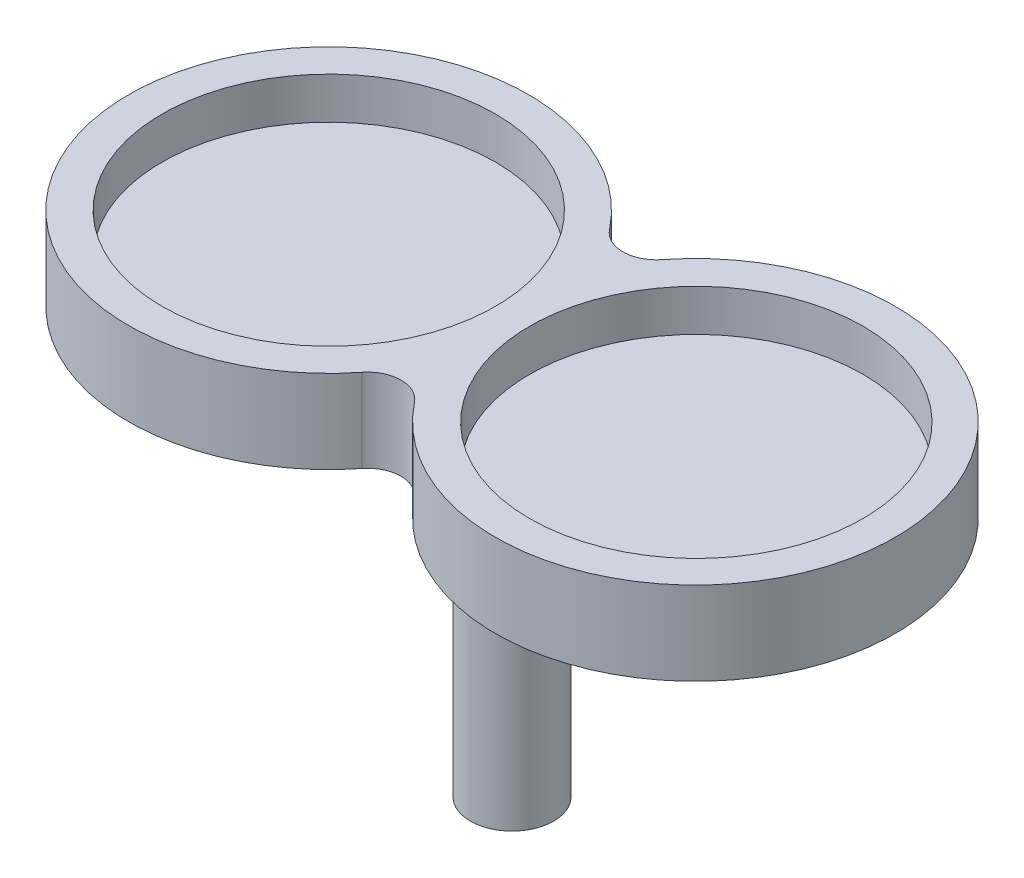
ISO-10303-21;
HEADER;
FILE_DESCRIPTION(('STEP AP214'),'2;1');
FILE_NAME('part.step','',(''),(''),'','','');
FILE_SCHEMA(('AUTOMOTIVE_DESIGN { 1 0 10303 214 1 1 1 1 }'));
ENDSEC;
DATA;
#1=APPLICATION_CONTEXT('core data for automotive mechanical design processes');
#2=APPLICATION_PROTOCOL_DEFINITION('international standard','automotive_design',2000,#1);
#3=PRODUCT_CONTEXT('',#1,'mechanical');
#4=PRODUCT('Part','Part','',(#3));
#5=PRODUCT_RELATED_PRODUCT_CATEGORY('part','',(#4));
#6=PRODUCT_DEFINITION_FORMATION('','',#4);
#7=PRODUCT_DEFINITION_CONTEXT('part definition',#1,'design');
#8=PRODUCT_DEFINITION('design','',#6,#7);
#9=PRODUCT_DEFINITION_SHAPE('','',#8);
#10=(LENGTH_UNIT() NAMED_UNIT(*) SI_UNIT(.MILLI.,.METRE.));
#11=(NAMED_UNIT(*) PLANE_ANGLE_UNIT() SI_UNIT($,.RADIAN.));
#12=(NAMED_UNIT(*) SI_UNIT($,.STERADIAN.) SOLID_ANGLE_UNIT());
#13=UNCERTAINTY_MEASURE_WITH_UNIT(LENGTH_MEASURE(1.E-05),#10,'distance_accuracy_value','');
#14=(GEOMETRIC_REPRESENTATION_CONTEXT(3) GLOBAL_UNCERTAINTY_ASSIGNED_CONTEXT((#13)) GLOBAL_UNIT_ASSIGNED_CONTEXT((#10,
#11,#12)) REPRESENTATION_CONTEXT('',''));
#15=CARTESIAN_POINT('',(0.,0.,0.));
#16=DIRECTION('',(0.,0.,1.));
#17=DIRECTION('',(1.,0.,0.));
#18=AXIS2_PLACEMENT_3D('',#15,#16,#17);
#19=CARTESIAN_POINT('',(-13.97,6.35,0.));
#20=DIRECTION('',(0.,-1.,0.));
#21=DIRECTION('',(0.,0.,-1.));
#22=AXIS2_PLACEMENT_3D('',#19,#20,#21);
#23=CYLINDRICAL_SURFACE('',#22,15.24);
#24=CARTESIAN_POINT('',(-13.97,0.,0.));
#25=DIRECTION('',(0.,1.,0.));
#26=DIRECTION('',(0.,0.,1.));
#27=AXIS2_PLACEMENT_3D('',#24,#25,#26);
#28=CIRCLE('',#27,15.24);
#29=CARTESIAN_POINT('',(-1.99571428571429,0.,-9.42730510976774));
#30=VERTEX_POINT('',#29);
#31=CARTESIAN_POINT('',(-1.99571428571428,0.,9.42730510976774));
#32=VERTEX_POINT('',#31);
#33=EDGE_CURVE('E106',#30,#32,#28,.T.);
#34=ORIENTED_EDGE('',*,*,#33,.T.);
#35=DIRECTION('',(0.,-1.,0.));
#36=VECTOR('',#35,1.);
#37=CARTESIAN_POINT('',(-1.99571428571428,6.35,9.42730510976775));
#38=LINE('',#37,#36);
#39=CARTESIAN_POINT('',(-1.99571428571428,6.35,9.42730510976774));
#40=VERTEX_POINT('',#39);
#41=EDGE_CURVE('E55',#32,#40,#38,.F.);
#42=ORIENTED_EDGE('',*,*,#41,.T.);
#43=CARTESIAN_POINT('',(-13.97,6.35,0.));
#44=DIRECTION('',(0.,1.,0.));
#45=DIRECTION('',(0.,0.,1.));
#46=AXIS2_PLACEMENT_3D('',#43,#44,#45);
#47=CIRCLE('',#46,15.24);
#48=CARTESIAN_POINT('',(-1.99571428571429,6.35,-9.42730510976774));
#49=VERTEX_POINT('',#48);
#50=EDGE_CURVE('E105',#49,#40,#47,.T.);
#51=ORIENTED_EDGE('',*,*,#50,.F.);
#52=DIRECTION('',(0.,-1.,0.));
#53=VECTOR('',#52,1.);
#54=CARTESIAN_POINT('',(-1.99571428571428,6.35,-9.42730510976774));
#55=LINE('',#54,#53);
#56=EDGE_CURVE('E100',#49,#30,#55,.T.);
#57=ORIENTED_EDGE('',*,*,#56,.T.);
#58=EDGE_LOOP('',(#34,#42,#51,#57));
#59=FACE_BOUND('',#58,.T.);
#60=ADVANCED_FACE('F39',(#59),#23,.T.);
#61=CARTESIAN_POINT('',(13.97,6.35,0.));
#62=DIRECTION('',(0.,-1.,0.));
#63=DIRECTION('',(0.,0.,-1.));
#64=AXIS2_PLACEMENT_3D('',#61,#62,#63);
#65=CYLINDRICAL_SURFACE('',#64,15.24);
#66=CARTESIAN_POINT('',(13.97,6.35,0.));
#67=DIRECTION('',(0.,1.,0.));
#68=DIRECTION('',(0.,0.,1.));
#69=AXIS2_PLACEMENT_3D('',#66,#67,#68);
#70=CIRCLE('',#69,15.24);
#71=CARTESIAN_POINT('',(1.99571428571429,6.35,9.42730510976774));
#72=VERTEX_POINT('',#71);
#73=CARTESIAN_POINT('',(1.99571428571428,6.35,-9.42730510976774));
#74=VERTEX_POINT('',#73);
#75=EDGE_CURVE('E98',#72,#74,#70,.T.);
#76=ORIENTED_EDGE('',*,*,#75,.F.);
#77=DIRECTION('',(0.,-1.,0.));
#78=VECTOR('',#77,1.);
#79=CARTESIAN_POINT('',(1.99571428571428,6.35,9.42730510976775));
#80=LINE('',#79,#78);
#81=CARTESIAN_POINT('',(1.99571428571429,0.,9.42730510976774));
#82=VERTEX_POINT('',#81);
#83=EDGE_CURVE('E84',#72,#82,#80,.T.);
#84=ORIENTED_EDGE('',*,*,#83,.T.);
#85=CARTESIAN_POINT('',(13.97,0.,0.));
#86=DIRECTION('',(0.,1.,0.));
#87=DIRECTION('',(0.,0.,1.));
#88=AXIS2_PLACEMENT_3D('',#85,#86,#87);
#89=CIRCLE('',#88,15.24);
#90=CARTESIAN_POINT('',(1.99571428571428,0.,-9.42730510976774));
#91=VERTEX_POINT('',#90);
#92=EDGE_CURVE('E96',#82,#91,#89,.T.);
#93=ORIENTED_EDGE('',*,*,#92,.T.);
#94=DIRECTION('',(0.,-1.,0.));
#95=VECTOR('',#94,1.);
#96=CARTESIAN_POINT('',(1.99571428571428,6.35,-9.42730510976774));
#97=LINE('',#96,#95);
#98=EDGE_CURVE('E101',#91,#74,#97,.F.);
#99=ORIENTED_EDGE('',*,*,#98,.T.);
#100=EDGE_LOOP('',(#76,#84,#93,#99));
#101=FACE_BOUND('',#100,.T.);
#102=ADVANCED_FACE('F95',(#101),#65,.T.);
#103=CARTESIAN_POINT('',(0.,6.35,0.));
#104=DIRECTION('',(0.,1.,0.));
#105=DIRECTION('',(0.,0.,1.));
#106=AXIS2_PLACEMENT_3D('',#103,#104,#105);
#107=PLANE('',#106);
#108=CARTESIAN_POINT('',(14.045562681836,6.35,0.));
#109=DIRECTION('',(0.,1.,0.));
#110=DIRECTION('',(0.,0.,1.));
#111=AXIS2_PLACEMENT_3D('',#108,#109,#110);
#112=CIRCLE('',#111,12.7);
#113=CARTESIAN_POINT('',(14.045562681836,6.35,12.7));
#114=VERTEX_POINT('',#113);
#115=EDGE_CURVE('E141',#114,#114,#112,.T.);
#116=ORIENTED_EDGE('',*,*,#115,.F.);
#117=EDGE_LOOP('',(#116));
#118=FACE_BOUND('',#117,.T.);
#119=CARTESIAN_POINT('',(-13.9596590883997,6.35,0.));
#120=DIRECTION('',(0.,1.,0.));
#121=DIRECTION('',(0.,0.,1.));
#122=AXIS2_PLACEMENT_3D('',#119,#120,#121);
#123=CIRCLE('',#122,12.7);
#124=CARTESIAN_POINT('',(-13.9596590883997,6.35,12.7));
#125=VERTEX_POINT('',#124);
#126=EDGE_CURVE('E133',#125,#125,#123,.T.);
#127=ORIENTED_EDGE('',*,*,#126,.F.);
#128=EDGE_LOOP('',(#127));
#129=FACE_BOUND('',#128,.T.);
#130=ORIENTED_EDGE('',*,*,#75,.T.);
#131=CARTESIAN_POINT('',(0.,6.35,-10.9985226280624));
#132=DIRECTION('',(0.,1.,0.));
#133=DIRECTION('',(0.,0.,1.));
#134=AXIS2_PLACEMENT_3D('',#131,#132,#133);
#135=CIRCLE('',#134,2.54);
#136=EDGE_CURVE('E11',#74,#49,#135,.F.);
#137=ORIENTED_EDGE('',*,*,#136,.T.);
#138=ORIENTED_EDGE('',*,*,#50,.T.);
#139=CARTESIAN_POINT('',(0.,6.35,10.9985226280624));
#140=DIRECTION('',(0.,1.,0.));
#141=DIRECTION('',(0.,0.,1.));
#142=AXIS2_PLACEMENT_3D('',#139,#140,#141);
#143=CIRCLE('',#142,2.54);
#144=EDGE_CURVE('E89',#40,#72,#143,.F.);
#145=ORIENTED_EDGE('',*,*,#144,.T.);
#146=EDGE_LOOP('',(#130,#137,#138,#145));
#147=FACE_BOUND('',#146,.T.);
#148=ADVANCED_FACE('F173',(#118,#129,#147),#107,.T.);
#149=CARTESIAN_POINT('',(0.,0.,0.));
#150=DIRECTION('',(0.,1.,0.));
#151=DIRECTION('',(0.,0.,1.));
#152=AXIS2_PLACEMENT_3D('',#149,#150,#151);
#153=PLANE('',#152);
#154=CARTESIAN_POINT('',(0.,0.,0.));
#155=DIRECTION('',(0.,1.,0.));
#156=DIRECTION('',(0.,0.,1.));
#157=AXIS2_PLACEMENT_3D('',#154,#155,#156);
#158=CIRCLE('',#157,5.715);
#159=CARTESIAN_POINT('',(0.,0.,5.715));
#160=VERTEX_POINT('',#159);
#161=EDGE_CURVE('E90',#160,#160,#158,.T.);
#162=ORIENTED_EDGE('',*,*,#161,.T.);
#163=EDGE_LOOP('',(#162));
#164=FACE_BOUND('',#163,.T.);
#165=ORIENTED_EDGE('',*,*,#33,.F.);
#166=CARTESIAN_POINT('',(0.,0.,-10.9985226280624));
#167=DIRECTION('',(0.,1.,0.));
#168=DIRECTION('',(0.,0.,1.));
#169=AXIS2_PLACEMENT_3D('',#166,#167,#168);
#170=CIRCLE('',#169,2.54);
#171=EDGE_CURVE('E48',#30,#91,#170,.T.);
#172=ORIENTED_EDGE('',*,*,#171,.T.);
#173=ORIENTED_EDGE('',*,*,#92,.F.);
#174=CARTESIAN_POINT('',(0.,0.,10.9985226280624));
#175=DIRECTION('',(0.,1.,0.));
#176=DIRECTION('',(0.,0.,1.));
#177=AXIS2_PLACEMENT_3D('',#174,#175,#176);
#178=CIRCLE('',#177,2.54);
#179=EDGE_CURVE('E80',#82,#32,#178,.T.);
#180=ORIENTED_EDGE('',*,*,#179,.T.);
#181=EDGE_LOOP('',(#165,#172,#173,#180));
#182=FACE_BOUND('',#181,.T.);
#183=ADVANCED_FACE('F103',(#164,#182),#153,.F.);
#184=CARTESIAN_POINT('',(-13.9596590883997,3.175,0.));
#185=DIRECTION('',(0.,1.,0.));
#186=DIRECTION('',(0.,0.,1.));
#187=AXIS2_PLACEMENT_3D('',#184,#185,#186);
#188=CYLINDRICAL_SURFACE('',#187,12.7);
#189=CARTESIAN_POINT('',(-13.9596590883997,3.175,0.));
#190=DIRECTION('',(0.,1.,0.));
#191=DIRECTION('',(0.,0.,1.));
#192=AXIS2_PLACEMENT_3D('',#189,#190,#191);
#193=CIRCLE('',#192,12.7);
#194=CARTESIAN_POINT('',(-13.9596590883997,3.175,12.7));
#195=VERTEX_POINT('',#194);
#196=EDGE_CURVE('E111',#195,#195,#193,.T.);
#197=ORIENTED_EDGE('',*,*,#196,.F.);
#198=EDGE_LOOP('',(#197));
#199=FACE_BOUND('',#198,.T.);
#200=ORIENTED_EDGE('',*,*,#126,.T.);
#201=EDGE_LOOP('',(#200));
#202=FACE_BOUND('',#201,.T.);
#203=ADVANCED_FACE('F192',(#199,#202),#188,.F.);
#204=CARTESIAN_POINT('',(-13.9596590883997,3.175,0.));
#205=DIRECTION('',(0.,1.,0.));
#206=DIRECTION('',(0.,0.,1.));
#207=AXIS2_PLACEMENT_3D('',#204,#205,#206);
#208=PLANE('',#207);
#209=ORIENTED_EDGE('',*,*,#196,.T.);
#210=EDGE_LOOP('',(#209));
#211=FACE_BOUND('',#210,.T.);
#212=ADVANCED_FACE('F199',(#211),#208,.T.);
#213=CARTESIAN_POINT('',(14.045562681836,3.175,0.));
#214=DIRECTION('',(0.,1.,0.));
#215=DIRECTION('',(0.,0.,1.));
#216=AXIS2_PLACEMENT_3D('',#213,#214,#215);
#217=CYLINDRICAL_SURFACE('',#216,12.7);
#218=CARTESIAN_POINT('',(14.045562681836,3.175,0.));
#219=DIRECTION('',(0.,1.,0.));
#220=DIRECTION('',(0.,0.,1.));
#221=AXIS2_PLACEMENT_3D('',#218,#219,#220);
#222=CIRCLE('',#221,12.7);
#223=CARTESIAN_POINT('',(14.045562681836,3.175,12.7));
#224=VERTEX_POINT('',#223);
#225=EDGE_CURVE('E137',#224,#224,#222,.T.);
#226=ORIENTED_EDGE('',*,*,#225,.F.);
#227=EDGE_LOOP('',(#226));
#228=FACE_BOUND('',#227,.T.);
#229=ORIENTED_EDGE('',*,*,#115,.T.);
#230=EDGE_LOOP('',(#229));
#231=FACE_BOUND('',#230,.T.);
#232=ADVANCED_FACE('F165',(#228,#231),#217,.F.);
#233=CARTESIAN_POINT('',(14.045562681836,3.175,0.));
#234=DIRECTION('',(0.,1.,0.));
#235=DIRECTION('',(0.,0.,1.));
#236=AXIS2_PLACEMENT_3D('',#233,#234,#235);
#237=PLANE('',#236);
#238=ORIENTED_EDGE('',*,*,#225,.T.);
#239=EDGE_LOOP('',(#238));
#240=FACE_BOUND('',#239,.T.);
#241=ADVANCED_FACE('F157',(#240),#237,.T.);
#242=CARTESIAN_POINT('',(0.,-25.4,0.));
#243=DIRECTION('',(0.,1.,0.));
#244=DIRECTION('',(0.,0.,1.));
#245=AXIS2_PLACEMENT_3D('',#242,#243,#244);
#246=CYLINDRICAL_SURFACE('',#245,3.175);
#247=CARTESIAN_POINT('',(0.,-2.54,0.));
#248=DIRECTION('',(0.,1.,0.));
#249=DIRECTION('',(0.,0.,1.));
#250=AXIS2_PLACEMENT_3D('',#247,#248,#249);
#251=CIRCLE('',#250,3.175);
#252=CARTESIAN_POINT('',(0.,-2.54,3.175));
#253=VERTEX_POINT('',#252);
#254=EDGE_CURVE('E122',#253,#253,#251,.F.);
#255=ORIENTED_EDGE('',*,*,#254,.T.);
#256=EDGE_LOOP('',(#255));
#257=FACE_BOUND('',#256,.T.);
#258=CARTESIAN_POINT('',(0.,-25.4,0.));
#259=DIRECTION('',(0.,-1.,0.));
#260=DIRECTION('',(0.,0.,-1.));
#261=AXIS2_PLACEMENT_3D('',#258,#259,#260);
#262=CIRCLE('',#261,3.175);
#263=CARTESIAN_POINT('',(0.,-25.4,-3.175));
#264=VERTEX_POINT('',#263);
#265=EDGE_CURVE('E145',#264,#264,#262,.T.);
#266=ORIENTED_EDGE('',*,*,#265,.F.);
#267=EDGE_LOOP('',(#266));
#268=FACE_BOUND('',#267,.T.);
#269=ADVANCED_FACE('F155',(#257,#268),#246,.T.);
#270=CARTESIAN_POINT('',(0.,-25.4,0.));
#271=DIRECTION('',(0.,-1.,0.));
#272=DIRECTION('',(0.,0.,-1.));
#273=AXIS2_PLACEMENT_3D('',#270,#271,#272);
#274=PLANE('',#273);
#275=ORIENTED_EDGE('',*,*,#265,.T.);
#276=EDGE_LOOP('',(#275));
#277=FACE_BOUND('',#276,.T.);
#278=ADVANCED_FACE('F153',(#277),#274,.T.);
#279=CARTESIAN_POINT('',(0.,6.35,10.9985226280624));
#280=DIRECTION('',(0.,1.,0.));
#281=DIRECTION('',(0.,0.,1.));
#282=AXIS2_PLACEMENT_3D('',#279,#280,#281);
#283=CYLINDRICAL_SURFACE('',#282,2.54);
#284=ORIENTED_EDGE('',*,*,#144,.F.);
#285=ORIENTED_EDGE('',*,*,#41,.F.);
#286=ORIENTED_EDGE('',*,*,#179,.F.);
#287=ORIENTED_EDGE('',*,*,#83,.F.);
#288=EDGE_LOOP('',(#284,#285,#286,#287));
#289=FACE_BOUND('',#288,.T.);
#290=ADVANCED_FACE('F83',(#289),#283,.F.);
#291=CARTESIAN_POINT('',(0.,6.35,-10.9985226280624));
#292=DIRECTION('',(0.,1.,0.));
#293=DIRECTION('',(0.,0.,1.));
#294=AXIS2_PLACEMENT_3D('',#291,#292,#293);
#295=CYLINDRICAL_SURFACE('',#294,2.54);
#296=ORIENTED_EDGE('',*,*,#136,.F.);
#297=ORIENTED_EDGE('',*,*,#98,.F.);
#298=ORIENTED_EDGE('',*,*,#171,.F.);
#299=ORIENTED_EDGE('',*,*,#56,.F.);
#300=EDGE_LOOP('',(#296,#297,#298,#299));
#301=FACE_BOUND('',#300,.T.);
#302=ADVANCED_FACE('F178',(#301),#295,.F.);
#303=CARTESIAN_POINT('',(0.,-2.54,0.));
#304=DIRECTION('',(0.,1.,0.));
#305=DIRECTION('',(0.,0.,1.));
#306=AXIS2_PLACEMENT_3D('',#303,#304,#305);
#307=TOROIDAL_SURFACE('',#306,5.715,2.54);
#308=ORIENTED_EDGE('',*,*,#161,.F.);
#309=EDGE_LOOP('',(#308));
#310=FACE_BOUND('',#309,.T.);
#311=ORIENTED_EDGE('',*,*,#254,.F.);
#312=EDGE_LOOP('',(#311));
#313=FACE_BOUND('',#312,.T.);
#314=ADVANCED_FACE('F41',(#310,#313),#307,.F.);
#315=CLOSED_SHELL('',(#60,#102,#148,#183,#203,#212,#232,#241,#269,#278,#290,#302,#314));
#316=MANIFOLD_SOLID_BREP('B2',#315);
#317=ADVANCED_BREP_SHAPE_REPRESENTATION('',(#18,#316),#14);
#318=SHAPE_DEFINITION_REPRESENTATION(#9,#317);
ENDSEC;
END-ISO-10303-21;
